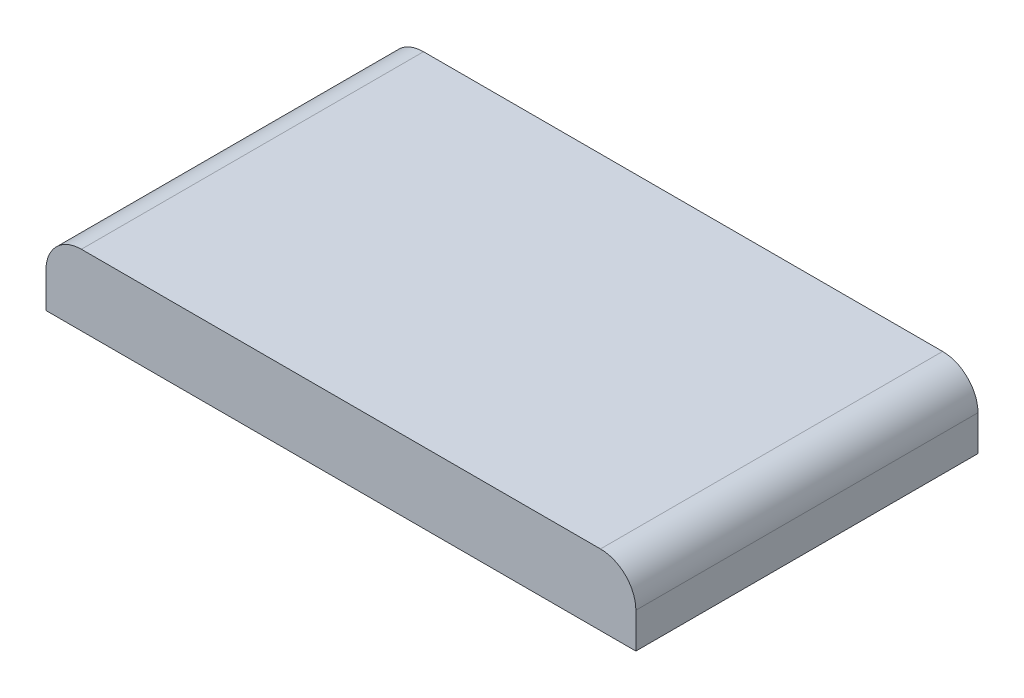
ISO-10303-21;
HEADER;
FILE_DESCRIPTION(('STEP AP214'),'2;1');
FILE_NAME('part.step','',(''),(''),'','','');
FILE_SCHEMA(('AUTOMOTIVE_DESIGN { 1 0 10303 214 1 1 1 1 }'));
ENDSEC;
DATA;
#1=APPLICATION_CONTEXT('core data for automotive mechanical design processes');
#2=APPLICATION_PROTOCOL_DEFINITION('international standard','automotive_design',2000,#1);
#3=PRODUCT_CONTEXT('',#1,'mechanical');
#4=PRODUCT('Part','Part','',(#3));
#5=PRODUCT_RELATED_PRODUCT_CATEGORY('part','',(#4));
#6=PRODUCT_DEFINITION_FORMATION('','',#4);
#7=PRODUCT_DEFINITION_CONTEXT('part definition',#1,'design');
#8=PRODUCT_DEFINITION('design','',#6,#7);
#9=PRODUCT_DEFINITION_SHAPE('','',#8);
#10=(LENGTH_UNIT() NAMED_UNIT(*) SI_UNIT(.MILLI.,.METRE.));
#11=(NAMED_UNIT(*) PLANE_ANGLE_UNIT() SI_UNIT($,.RADIAN.));
#12=(NAMED_UNIT(*) SI_UNIT($,.STERADIAN.) SOLID_ANGLE_UNIT());
#13=UNCERTAINTY_MEASURE_WITH_UNIT(LENGTH_MEASURE(1.E-05),#10,'distance_accuracy_value','');
#14=(GEOMETRIC_REPRESENTATION_CONTEXT(3) GLOBAL_UNCERTAINTY_ASSIGNED_CONTEXT((#13)) GLOBAL_UNIT_ASSIGNED_CONTEXT((#10,
#11,#12)) REPRESENTATION_CONTEXT('',''));
#15=CARTESIAN_POINT('',(0.,0.,0.));
#16=DIRECTION('',(0.,0.,1.));
#17=DIRECTION('',(1.,0.,0.));
#18=AXIS2_PLACEMENT_3D('',#15,#16,#17);
#19=CARTESIAN_POINT('',(-121.38805268943,15.24,-83.5949367088608));
#20=DIRECTION('',(1.,0.,0.));
#21=DIRECTION('',(0.,0.,-1.));
#22=AXIS2_PLACEMENT_3D('',#19,#20,#21);
#23=PLANE('',#22);
#24=DIRECTION('',(0.,-1.,0.));
#25=VECTOR('',#24,1.);
#26=CARTESIAN_POINT('',(-121.38805268943,15.24,-9.93493670886079));
#27=LINE('',#26,#25);
#28=CARTESIAN_POINT('',(-121.38805268943,7.62,-9.93493670886079));
#29=VERTEX_POINT('',#28);
#30=CARTESIAN_POINT('',(-121.38805268943,0.,-9.93493670886079));
#31=VERTEX_POINT('',#30);
#32=EDGE_CURVE('E87',#29,#31,#27,.T.);
#33=ORIENTED_EDGE('',*,*,#32,.F.);
#34=DIRECTION('',(0.,0.,1.));
#35=VECTOR('',#34,1.);
#36=CARTESIAN_POINT('',(-121.38805268943,7.62,-83.5949367088608));
#37=LINE('',#36,#35);
#38=CARTESIAN_POINT('',(-121.38805268943,7.62,-83.5949367088608));
#39=VERTEX_POINT('',#38);
#40=EDGE_CURVE('E58',#29,#39,#37,.F.);
#41=ORIENTED_EDGE('',*,*,#40,.T.);
#42=DIRECTION('',(0.,-1.,0.));
#43=VECTOR('',#42,1.);
#44=CARTESIAN_POINT('',(-121.38805268943,15.24,-83.5949367088608));
#45=LINE('',#44,#43);
#46=CARTESIAN_POINT('',(-121.38805268943,0.,-83.5949367088608));
#47=VERTEX_POINT('',#46);
#48=EDGE_CURVE('E107',#39,#47,#45,.T.);
#49=ORIENTED_EDGE('',*,*,#48,.T.);
#50=DIRECTION('',(0.,0.,1.));
#51=VECTOR('',#50,1.);
#52=CARTESIAN_POINT('',(-121.38805268943,0.,-83.5949367088608));
#53=LINE('',#52,#51);
#54=EDGE_CURVE('E103',#47,#31,#53,.T.);
#55=ORIENTED_EDGE('',*,*,#54,.T.);
#56=EDGE_LOOP('',(#33,#41,#49,#55));
#57=FACE_BOUND('',#56,.T.);
#58=ADVANCED_FACE('F35',(#57),#23,.F.);
#59=CARTESIAN_POINT('',(-121.38805268943,15.24,-9.93493670886079));
#60=DIRECTION('',(0.,0.,-1.));
#61=DIRECTION('',(-1.,0.,0.));
#62=AXIS2_PLACEMENT_3D('',#59,#60,#61);
#63=PLANE('',#62);
#64=DIRECTION('',(1.,0.,0.));
#65=VECTOR('',#64,1.);
#66=CARTESIAN_POINT('',(-121.38805268943,15.24,-9.93493670886079));
#67=LINE('',#66,#65);
#68=CARTESIAN_POINT('',(-113.76805268943,15.24,-9.93493670886079));
#69=VERTEX_POINT('',#68);
#70=CARTESIAN_POINT('',(-2.00805268943026,15.24,-9.93493670886079));
#71=VERTEX_POINT('',#70);
#72=EDGE_CURVE('E117',#69,#71,#67,.T.);
#73=ORIENTED_EDGE('',*,*,#72,.F.);
#74=CARTESIAN_POINT('',(-113.76805268943,7.62,-9.93493670886079));
#75=DIRECTION('',(0.,0.,-1.));
#76=DIRECTION('',(-1.,0.,0.));
#77=AXIS2_PLACEMENT_3D('',#74,#75,#76);
#78=CIRCLE('',#77,7.62);
#79=EDGE_CURVE('E94',#69,#29,#78,.F.);
#80=ORIENTED_EDGE('',*,*,#79,.T.);
#81=ORIENTED_EDGE('',*,*,#32,.T.);
#82=DIRECTION('',(1.,0.,0.));
#83=VECTOR('',#82,1.);
#84=CARTESIAN_POINT('',(-121.38805268943,0.,-9.93493670886079));
#85=LINE('',#84,#83);
#86=CARTESIAN_POINT('',(5.61194731056974,0.,-9.93493670886079));
#87=VERTEX_POINT('',#86);
#88=EDGE_CURVE('E92',#31,#87,#85,.T.);
#89=ORIENTED_EDGE('',*,*,#88,.T.);
#90=DIRECTION('',(0.,-1.,0.));
#91=VECTOR('',#90,1.);
#92=CARTESIAN_POINT('',(5.61194731056974,15.24,-9.93493670886079));
#93=LINE('',#92,#91);
#94=CARTESIAN_POINT('',(5.61194731056974,7.62,-9.93493670886079));
#95=VERTEX_POINT('',#94);
#96=EDGE_CURVE('E97',#95,#87,#93,.T.);
#97=ORIENTED_EDGE('',*,*,#96,.F.);
#98=CARTESIAN_POINT('',(-2.00805268943026,7.62,-9.93493670886079));
#99=DIRECTION('',(0.,0.,-1.));
#100=DIRECTION('',(-1.,0.,0.));
#101=AXIS2_PLACEMENT_3D('',#98,#99,#100);
#102=CIRCLE('',#101,7.62);
#103=EDGE_CURVE('E127',#95,#71,#102,.F.);
#104=ORIENTED_EDGE('',*,*,#103,.T.);
#105=EDGE_LOOP('',(#73,#80,#81,#89,#97,#104));
#106=FACE_BOUND('',#105,.T.);
#107=ADVANCED_FACE('F90',(#106),#63,.F.);
#108=CARTESIAN_POINT('',(5.61194731056973,15.24,-83.5949367088608));
#109=DIRECTION('',(-1.,0.,0.));
#110=DIRECTION('',(0.,0.,1.));
#111=AXIS2_PLACEMENT_3D('',#108,#109,#110);
#112=PLANE('',#111);
#113=DIRECTION('',(0.,-1.,0.));
#114=VECTOR('',#113,1.);
#115=CARTESIAN_POINT('',(5.61194731056973,15.24,-83.5949367088608));
#116=LINE('',#115,#114);
#117=CARTESIAN_POINT('',(5.61194731056973,7.62,-83.5949367088608));
#118=VERTEX_POINT('',#117);
#119=CARTESIAN_POINT('',(5.61194731056973,0.,-83.5949367088608));
#120=VERTEX_POINT('',#119);
#121=EDGE_CURVE('E119',#118,#120,#116,.T.);
#122=ORIENTED_EDGE('',*,*,#121,.F.);
#123=DIRECTION('',(0.,0.,-1.));
#124=VECTOR('',#123,1.);
#125=CARTESIAN_POINT('',(5.61194731056974,7.62,-9.93493670886079));
#126=LINE('',#125,#124);
#127=EDGE_CURVE('E11',#118,#95,#126,.F.);
#128=ORIENTED_EDGE('',*,*,#127,.T.);
#129=ORIENTED_EDGE('',*,*,#96,.T.);
#130=DIRECTION('',(0.,0.,-1.));
#131=VECTOR('',#130,1.);
#132=CARTESIAN_POINT('',(5.61194731056973,0.,-83.5949367088608));
#133=LINE('',#132,#131);
#134=EDGE_CURVE('E105',#87,#120,#133,.T.);
#135=ORIENTED_EDGE('',*,*,#134,.T.);
#136=EDGE_LOOP('',(#122,#128,#129,#135));
#137=FACE_BOUND('',#136,.T.);
#138=ADVANCED_FACE('F153',(#137),#112,.F.);
#139=CARTESIAN_POINT('',(-121.38805268943,15.24,-83.5949367088608));
#140=DIRECTION('',(0.,0.,1.));
#141=DIRECTION('',(1.,0.,0.));
#142=AXIS2_PLACEMENT_3D('',#139,#140,#141);
#143=PLANE('',#142);
#144=ORIENTED_EDGE('',*,*,#48,.F.);
#145=CARTESIAN_POINT('',(-113.76805268943,7.62,-83.5949367088608));
#146=DIRECTION('',(0.,0.,1.));
#147=DIRECTION('',(1.,0.,0.));
#148=AXIS2_PLACEMENT_3D('',#145,#146,#147);
#149=CIRCLE('',#148,7.62);
#150=CARTESIAN_POINT('',(-113.76805268943,15.24,-83.5949367088608));
#151=VERTEX_POINT('',#150);
#152=EDGE_CURVE('E43',#39,#151,#149,.F.);
#153=ORIENTED_EDGE('',*,*,#152,.T.);
#154=DIRECTION('',(-1.,0.,0.));
#155=VECTOR('',#154,1.);
#156=CARTESIAN_POINT('',(-121.38805268943,15.24,-83.5949367088608));
#157=LINE('',#156,#155);
#158=CARTESIAN_POINT('',(-2.00805268943026,15.24,-83.5949367088608));
#159=VERTEX_POINT('',#158);
#160=EDGE_CURVE('E111',#159,#151,#157,.T.);
#161=ORIENTED_EDGE('',*,*,#160,.F.);
#162=CARTESIAN_POINT('',(-2.00805268943026,7.62,-83.5949367088608));
#163=DIRECTION('',(0.,0.,1.));
#164=DIRECTION('',(1.,0.,0.));
#165=AXIS2_PLACEMENT_3D('',#162,#163,#164);
#166=CIRCLE('',#165,7.62);
#167=EDGE_CURVE('E50',#159,#118,#166,.F.);
#168=ORIENTED_EDGE('',*,*,#167,.T.);
#169=ORIENTED_EDGE('',*,*,#121,.T.);
#170=DIRECTION('',(-1.,0.,0.));
#171=VECTOR('',#170,1.);
#172=CARTESIAN_POINT('',(-121.38805268943,0.,-83.5949367088608));
#173=LINE('',#172,#171);
#174=EDGE_CURVE('E115',#120,#47,#173,.T.);
#175=ORIENTED_EDGE('',*,*,#174,.T.);
#176=EDGE_LOOP('',(#144,#153,#161,#168,#169,#175));
#177=FACE_BOUND('',#176,.T.);
#178=ADVANCED_FACE('F133',(#177),#143,.F.);
#179=CARTESIAN_POINT('',(0.,15.24,0.));
#180=DIRECTION('',(0.,1.,0.));
#181=DIRECTION('',(0.,0.,1.));
#182=AXIS2_PLACEMENT_3D('',#179,#180,#181);
#183=PLANE('',#182);
#184=ORIENTED_EDGE('',*,*,#160,.T.);
#185=DIRECTION('',(0.,0.,1.));
#186=VECTOR('',#185,1.);
#187=CARTESIAN_POINT('',(-113.76805268943,15.24,-9.93493670886079));
#188=LINE('',#187,#186);
#189=EDGE_CURVE('E124',#151,#69,#188,.T.);
#190=ORIENTED_EDGE('',*,*,#189,.T.);
#191=ORIENTED_EDGE('',*,*,#72,.T.);
#192=DIRECTION('',(0.,0.,-1.));
#193=VECTOR('',#192,1.);
#194=CARTESIAN_POINT('',(-2.00805268943026,15.24,-83.5949367088608));
#195=LINE('',#194,#193);
#196=EDGE_CURVE('E96',#71,#159,#195,.T.);
#197=ORIENTED_EDGE('',*,*,#196,.T.);
#198=EDGE_LOOP('',(#184,#190,#191,#197));
#199=FACE_BOUND('',#198,.T.);
#200=ADVANCED_FACE('F137',(#199),#183,.T.);
#201=CARTESIAN_POINT('',(0.,0.,0.));
#202=DIRECTION('',(0.,1.,0.));
#203=DIRECTION('',(0.,0.,1.));
#204=AXIS2_PLACEMENT_3D('',#201,#202,#203);
#205=PLANE('',#204);
#206=ORIENTED_EDGE('',*,*,#54,.F.);
#207=ORIENTED_EDGE('',*,*,#174,.F.);
#208=ORIENTED_EDGE('',*,*,#134,.F.);
#209=ORIENTED_EDGE('',*,*,#88,.F.);
#210=EDGE_LOOP('',(#206,#207,#208,#209));
#211=FACE_BOUND('',#210,.T.);
#212=ADVANCED_FACE('F101',(#211),#205,.F.);
#213=CARTESIAN_POINT('',(-113.76805268943,7.62,0.));
#214=DIRECTION('',(0.,0.,-1.));
#215=DIRECTION('',(-1.,0.,0.));
#216=AXIS2_PLACEMENT_3D('',#213,#214,#215);
#217=CYLINDRICAL_SURFACE('',#216,7.62);
#218=ORIENTED_EDGE('',*,*,#152,.F.);
#219=ORIENTED_EDGE('',*,*,#40,.F.);
#220=ORIENTED_EDGE('',*,*,#79,.F.);
#221=ORIENTED_EDGE('',*,*,#189,.F.);
#222=EDGE_LOOP('',(#218,#219,#220,#221));
#223=FACE_BOUND('',#222,.T.);
#224=ADVANCED_FACE('F140',(#223),#217,.T.);
#225=CARTESIAN_POINT('',(-2.00805268943025,7.62,0.));
#226=DIRECTION('',(0.,0.,1.));
#227=DIRECTION('',(1.,0.,0.));
#228=AXIS2_PLACEMENT_3D('',#225,#226,#227);
#229=CYLINDRICAL_SURFACE('',#228,7.62);
#230=ORIENTED_EDGE('',*,*,#103,.F.);
#231=ORIENTED_EDGE('',*,*,#127,.F.);
#232=ORIENTED_EDGE('',*,*,#167,.F.);
#233=ORIENTED_EDGE('',*,*,#196,.F.);
#234=EDGE_LOOP('',(#230,#231,#232,#233));
#235=FACE_BOUND('',#234,.T.);
#236=ADVANCED_FACE('F37',(#235),#229,.T.);
#237=CLOSED_SHELL('',(#58,#107,#138,#178,#200,#212,#224,#236));
#238=MANIFOLD_SOLID_BREP('B2',#237);
#239=ADVANCED_BREP_SHAPE_REPRESENTATION('',(#18,#238),#14);
#240=SHAPE_DEFINITION_REPRESENTATION(#9,#239);
ENDSEC;
END-ISO-10303-21;
